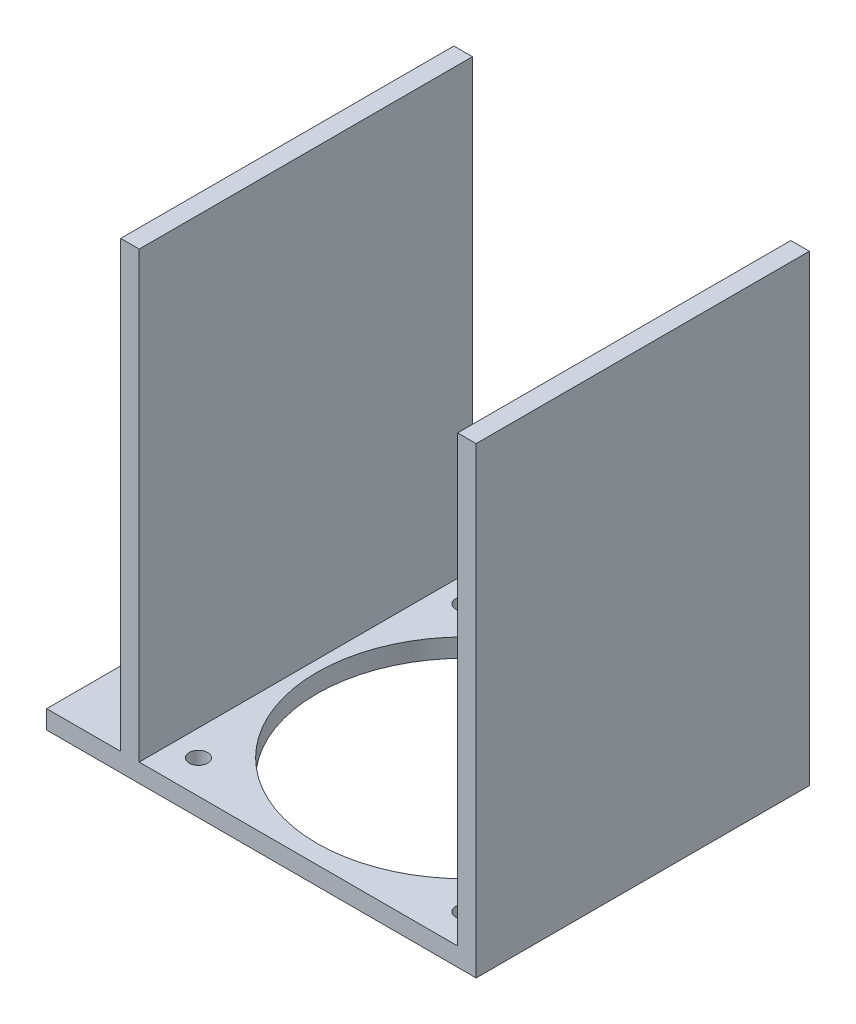
ISO-10303-21;
HEADER;
FILE_DESCRIPTION(('STEP AP214'),'2;1');
FILE_NAME('part.step','',(''),(''),'','','');
FILE_SCHEMA(('AUTOMOTIVE_DESIGN { 1 0 10303 214 1 1 1 1 }'));
ENDSEC;
DATA;
#1=APPLICATION_CONTEXT('core data for automotive mechanical design processes');
#2=APPLICATION_PROTOCOL_DEFINITION('international standard','automotive_design',2000,#1);
#3=PRODUCT_CONTEXT('',#1,'mechanical');
#4=PRODUCT('Part','Part','',(#3));
#5=PRODUCT_RELATED_PRODUCT_CATEGORY('part','',(#4));
#6=PRODUCT_DEFINITION_FORMATION('','',#4);
#7=PRODUCT_DEFINITION_CONTEXT('part definition',#1,'design');
#8=PRODUCT_DEFINITION('design','',#6,#7);
#9=PRODUCT_DEFINITION_SHAPE('','',#8);
#10=(LENGTH_UNIT() NAMED_UNIT(*) SI_UNIT(.MILLI.,.METRE.));
#11=(NAMED_UNIT(*) PLANE_ANGLE_UNIT() SI_UNIT($,.RADIAN.));
#12=(NAMED_UNIT(*) SI_UNIT($,.STERADIAN.) SOLID_ANGLE_UNIT());
#13=UNCERTAINTY_MEASURE_WITH_UNIT(LENGTH_MEASURE(1.E-05),#10,'distance_accuracy_value','');
#14=(GEOMETRIC_REPRESENTATION_CONTEXT(3) GLOBAL_UNCERTAINTY_ASSIGNED_CONTEXT((#13)) GLOBAL_UNIT_ASSIGNED_CONTEXT((#10,
#11,#12)) REPRESENTATION_CONTEXT('',''));
#15=CARTESIAN_POINT('',(0.,0.,0.));
#16=DIRECTION('',(0.,0.,1.));
#17=DIRECTION('',(1.,0.,0.));
#18=AXIS2_PLACEMENT_3D('',#15,#16,#17);
#19=CARTESIAN_POINT('',(0.,5.,0.));
#20=DIRECTION('',(0.,-1.,0.));
#21=DIRECTION('',(0.,0.,-1.));
#22=AXIS2_PLACEMENT_3D('',#19,#20,#21);
#23=PLANE('',#22);
#24=DIRECTION('',(0.,0.,1.));
#25=VECTOR('',#24,1.);
#26=CARTESIAN_POINT('',(20.,5.,-90.));
#27=LINE('',#26,#25);
#28=CARTESIAN_POINT('',(20.,5.,-90.));
#29=VERTEX_POINT('',#28);
#30=CARTESIAN_POINT('',(20.,5.,0.));
#31=VERTEX_POINT('',#30);
#32=EDGE_CURVE('E132',#29,#31,#27,.T.);
#33=ORIENTED_EDGE('',*,*,#32,.F.);
#34=DIRECTION('',(-1.,0.,0.));
#35=VECTOR('',#34,1.);
#36=CARTESIAN_POINT('',(0.,5.,-90.));
#37=LINE('',#36,#35);
#38=CARTESIAN_POINT('',(0.,5.,-90.));
#39=VERTEX_POINT('',#38);
#40=EDGE_CURVE('E193',#29,#39,#37,.T.);
#41=ORIENTED_EDGE('',*,*,#40,.T.);
#42=DIRECTION('',(0.,0.,1.));
#43=VECTOR('',#42,1.);
#44=CARTESIAN_POINT('',(0.,5.,0.));
#45=LINE('',#44,#43);
#46=CARTESIAN_POINT('',(0.,5.,0.));
#47=VERTEX_POINT('',#46);
#48=EDGE_CURVE('E188',#39,#47,#45,.T.);
#49=ORIENTED_EDGE('',*,*,#48,.T.);
#50=DIRECTION('',(1.,0.,0.));
#51=VECTOR('',#50,1.);
#52=CARTESIAN_POINT('',(0.,5.,0.));
#53=LINE('',#52,#51);
#54=EDGE_CURVE('E56',#47,#31,#53,.T.);
#55=ORIENTED_EDGE('',*,*,#54,.T.);
#56=EDGE_LOOP('',(#33,#41,#49,#55));
#57=FACE_BOUND('',#56,.T.);
#58=ADVANCED_FACE('F33',(#57),#23,.F.);
#59=CARTESIAN_POINT('',(68.,5.,-45.));
#60=DIRECTION('',(0.,-1.,0.));
#61=DIRECTION('',(0.,0.,-1.));
#62=AXIS2_PLACEMENT_3D('',#59,#60,#61);
#63=CIRCLE('',#62,40.);
#64=CARTESIAN_POINT('',(68.,5.,-85.));
#65=VERTEX_POINT('',#64);
#66=EDGE_CURVE('E165',#65,#65,#63,.T.);
#67=ORIENTED_EDGE('',*,*,#66,.T.);
#68=EDGE_LOOP('',(#67));
#69=FACE_BOUND('',#68,.T.);
#70=CARTESIAN_POINT('',(31.9999999999996,5.,-9.00000000000036));
#71=DIRECTION('',(0.,-1.,0.));
#72=DIRECTION('',(0.,0.,-1.));
#73=AXIS2_PLACEMENT_3D('',#70,#71,#72);
#74=CIRCLE('',#73,2.5);
#75=CARTESIAN_POINT('',(31.9999999999996,5.,-11.5000000000004));
#76=VERTEX_POINT('',#75);
#77=EDGE_CURVE('E150',#76,#76,#74,.T.);
#78=ORIENTED_EDGE('',*,*,#77,.T.);
#79=EDGE_LOOP('',(#78));
#80=FACE_BOUND('',#79,.T.);
#81=CARTESIAN_POINT('',(104.,5.,-8.99999999999999));
#82=DIRECTION('',(0.,-1.,0.));
#83=DIRECTION('',(0.,0.,-1.));
#84=AXIS2_PLACEMENT_3D('',#81,#82,#83);
#85=CIRCLE('',#84,2.5);
#86=CARTESIAN_POINT('',(104.,5.,-11.5));
#87=VERTEX_POINT('',#86);
#88=EDGE_CURVE('E153',#87,#87,#85,.T.);
#89=ORIENTED_EDGE('',*,*,#88,.T.);
#90=EDGE_LOOP('',(#89));
#91=FACE_BOUND('',#90,.T.);
#92=CARTESIAN_POINT('',(104.,5.,-80.9999999999998));
#93=DIRECTION('',(0.,-1.,0.));
#94=DIRECTION('',(0.,0.,-1.));
#95=AXIS2_PLACEMENT_3D('',#92,#93,#94);
#96=CIRCLE('',#95,2.5);
#97=CARTESIAN_POINT('',(104.,5.,-83.4999999999999));
#98=VERTEX_POINT('',#97);
#99=EDGE_CURVE('E156',#98,#98,#96,.T.);
#100=ORIENTED_EDGE('',*,*,#99,.T.);
#101=EDGE_LOOP('',(#100));
#102=FACE_BOUND('',#101,.T.);
#103=CARTESIAN_POINT('',(32.,5.,-81.));
#104=DIRECTION('',(0.,-1.,0.));
#105=DIRECTION('',(0.,0.,-1.));
#106=AXIS2_PLACEMENT_3D('',#103,#104,#105);
#107=CIRCLE('',#106,2.5);
#108=CARTESIAN_POINT('',(32.,5.,-83.5));
#109=VERTEX_POINT('',#108);
#110=EDGE_CURVE('E159',#109,#109,#107,.T.);
#111=ORIENTED_EDGE('',*,*,#110,.T.);
#112=EDGE_LOOP('',(#111));
#113=FACE_BOUND('',#112,.T.);
#114=DIRECTION('',(0.,0.,-1.));
#115=VECTOR('',#114,1.);
#116=CARTESIAN_POINT('',(25.,5.,-90.));
#117=LINE('',#116,#115);
#118=CARTESIAN_POINT('',(25.,5.,0.));
#119=VERTEX_POINT('',#118);
#120=CARTESIAN_POINT('',(25.,5.,-90.));
#121=VERTEX_POINT('',#120);
#122=EDGE_CURVE('E48',#119,#121,#117,.T.);
#123=ORIENTED_EDGE('',*,*,#122,.F.);
#124=CARTESIAN_POINT('',(111.,5.,0.));
#125=VERTEX_POINT('',#124);
#126=EDGE_CURVE('E190',#119,#125,#53,.T.);
#127=ORIENTED_EDGE('',*,*,#126,.T.);
#128=DIRECTION('',(0.,0.,1.));
#129=VECTOR('',#128,1.);
#130=CARTESIAN_POINT('',(111.,5.,-90.));
#131=LINE('',#130,#129);
#132=CARTESIAN_POINT('',(111.,5.,-90.));
#133=VERTEX_POINT('',#132);
#134=EDGE_CURVE('E168',#133,#125,#131,.T.);
#135=ORIENTED_EDGE('',*,*,#134,.F.);
#136=EDGE_CURVE('E194',#133,#121,#37,.T.);
#137=ORIENTED_EDGE('',*,*,#136,.T.);
#138=EDGE_LOOP('',(#123,#127,#135,#137));
#139=FACE_BOUND('',#138,.T.);
#140=ADVANCED_FACE('F243',(#69,#80,#91,#102,#113,#139),#23,.F.);
#141=CARTESIAN_POINT('',(0.,5.,0.));
#142=DIRECTION('',(1.,0.,0.));
#143=DIRECTION('',(0.,0.,-1.));
#144=AXIS2_PLACEMENT_3D('',#141,#142,#143);
#145=PLANE('',#144);
#146=DIRECTION('',(0.,0.,1.));
#147=VECTOR('',#146,1.);
#148=CARTESIAN_POINT('',(0.,0.,0.));
#149=LINE('',#148,#147);
#150=CARTESIAN_POINT('',(0.,0.,-90.));
#151=VERTEX_POINT('',#150);
#152=CARTESIAN_POINT('',(0.,0.,0.));
#153=VERTEX_POINT('',#152);
#154=EDGE_CURVE('E187',#151,#153,#149,.T.);
#155=ORIENTED_EDGE('',*,*,#154,.T.);
#156=DIRECTION('',(0.,-1.,0.));
#157=VECTOR('',#156,1.);
#158=CARTESIAN_POINT('',(0.,5.,0.));
#159=LINE('',#158,#157);
#160=EDGE_CURVE('E11',#47,#153,#159,.T.);
#161=ORIENTED_EDGE('',*,*,#160,.F.);
#162=ORIENTED_EDGE('',*,*,#48,.F.);
#163=DIRECTION('',(0.,-1.,0.));
#164=VECTOR('',#163,1.);
#165=CARTESIAN_POINT('',(0.,5.,-90.));
#166=LINE('',#165,#164);
#167=EDGE_CURVE('E196',#39,#151,#166,.T.);
#168=ORIENTED_EDGE('',*,*,#167,.T.);
#169=EDGE_LOOP('',(#155,#161,#162,#168));
#170=FACE_BOUND('',#169,.T.);
#171=ADVANCED_FACE('F35',(#170),#145,.F.);
#172=CARTESIAN_POINT('',(0.,5.,0.));
#173=DIRECTION('',(0.,0.,-1.));
#174=DIRECTION('',(-1.,0.,0.));
#175=AXIS2_PLACEMENT_3D('',#172,#173,#174);
#176=PLANE('',#175);
#177=DIRECTION('',(1.,0.,0.));
#178=VECTOR('',#177,1.);
#179=CARTESIAN_POINT('',(0.,0.,0.));
#180=LINE('',#179,#178);
#181=CARTESIAN_POINT('',(116.,0.,0.));
#182=VERTEX_POINT('',#181);
#183=EDGE_CURVE('E199',#153,#182,#180,.T.);
#184=ORIENTED_EDGE('',*,*,#183,.T.);
#185=DIRECTION('',(0.,-1.,0.));
#186=VECTOR('',#185,1.);
#187=CARTESIAN_POINT('',(116.,5.,0.));
#188=LINE('',#187,#186);
#189=CARTESIAN_POINT('',(116.,125.,0.));
#190=VERTEX_POINT('',#189);
#191=EDGE_CURVE('E41',#190,#182,#188,.T.);
#192=ORIENTED_EDGE('',*,*,#191,.F.);
#193=DIRECTION('',(1.,0.,0.));
#194=VECTOR('',#193,1.);
#195=CARTESIAN_POINT('',(116.,125.,0.));
#196=LINE('',#195,#194);
#197=CARTESIAN_POINT('',(111.,125.,0.));
#198=VERTEX_POINT('',#197);
#199=EDGE_CURVE('E176',#198,#190,#196,.T.);
#200=ORIENTED_EDGE('',*,*,#199,.F.);
#201=DIRECTION('',(0.,-1.,0.));
#202=VECTOR('',#201,1.);
#203=CARTESIAN_POINT('',(111.,125.,0.));
#204=LINE('',#203,#202);
#205=EDGE_CURVE('E179',#198,#125,#204,.T.);
#206=ORIENTED_EDGE('',*,*,#205,.T.);
#207=ORIENTED_EDGE('',*,*,#126,.F.);
#208=DIRECTION('',(0.,-1.,0.));
#209=VECTOR('',#208,1.);
#210=CARTESIAN_POINT('',(25.,125.,0.));
#211=LINE('',#210,#209);
#212=CARTESIAN_POINT('',(25.,125.,0.));
#213=VERTEX_POINT('',#212);
#214=EDGE_CURVE('E117',#213,#119,#211,.T.);
#215=ORIENTED_EDGE('',*,*,#214,.F.);
#216=DIRECTION('',(1.,0.,0.));
#217=VECTOR('',#216,1.);
#218=CARTESIAN_POINT('',(20.,125.,0.));
#219=LINE('',#218,#217);
#220=CARTESIAN_POINT('',(20.,125.,0.));
#221=VERTEX_POINT('',#220);
#222=EDGE_CURVE('E110',#221,#213,#219,.T.);
#223=ORIENTED_EDGE('',*,*,#222,.F.);
#224=DIRECTION('',(0.,-1.,0.));
#225=VECTOR('',#224,1.);
#226=CARTESIAN_POINT('',(20.,125.,0.));
#227=LINE('',#226,#225);
#228=EDGE_CURVE('E114',#221,#31,#227,.T.);
#229=ORIENTED_EDGE('',*,*,#228,.T.);
#230=ORIENTED_EDGE('',*,*,#54,.F.);
#231=ORIENTED_EDGE('',*,*,#160,.T.);
#232=EDGE_LOOP('',(#184,#192,#200,#206,#207,#215,#223,#229,#230,#231));
#233=FACE_BOUND('',#232,.T.);
#234=ADVANCED_FACE('F112',(#233),#176,.F.);
#235=CARTESIAN_POINT('',(116.,5.,0.));
#236=DIRECTION('',(-1.,0.,0.));
#237=DIRECTION('',(0.,0.,1.));
#238=AXIS2_PLACEMENT_3D('',#235,#236,#237);
#239=PLANE('',#238);
#240=DIRECTION('',(0.,0.,-1.));
#241=VECTOR('',#240,1.);
#242=CARTESIAN_POINT('',(116.,0.,0.));
#243=LINE('',#242,#241);
#244=CARTESIAN_POINT('',(116.,0.,-90.));
#245=VERTEX_POINT('',#244);
#246=EDGE_CURVE('E201',#182,#245,#243,.T.);
#247=ORIENTED_EDGE('',*,*,#246,.T.);
#248=DIRECTION('',(0.,-1.,0.));
#249=VECTOR('',#248,1.);
#250=CARTESIAN_POINT('',(116.,5.,-90.));
#251=LINE('',#250,#249);
#252=CARTESIAN_POINT('',(116.,125.,-90.));
#253=VERTEX_POINT('',#252);
#254=EDGE_CURVE('E206',#253,#245,#251,.T.);
#255=ORIENTED_EDGE('',*,*,#254,.F.);
#256=DIRECTION('',(0.,0.,-1.));
#257=VECTOR('',#256,1.);
#258=CARTESIAN_POINT('',(116.,125.,-90.));
#259=LINE('',#258,#257);
#260=EDGE_CURVE('E169',#190,#253,#259,.T.);
#261=ORIENTED_EDGE('',*,*,#260,.F.);
#262=ORIENTED_EDGE('',*,*,#191,.T.);
#263=EDGE_LOOP('',(#247,#255,#261,#262));
#264=FACE_BOUND('',#263,.T.);
#265=ADVANCED_FACE('F212',(#264),#239,.F.);
#266=CARTESIAN_POINT('',(0.,5.,-90.));
#267=DIRECTION('',(0.,0.,1.));
#268=DIRECTION('',(1.,0.,0.));
#269=AXIS2_PLACEMENT_3D('',#266,#267,#268);
#270=PLANE('',#269);
#271=DIRECTION('',(-1.,0.,0.));
#272=VECTOR('',#271,1.);
#273=CARTESIAN_POINT('',(0.,0.,-90.));
#274=LINE('',#273,#272);
#275=EDGE_CURVE('E191',#245,#151,#274,.T.);
#276=ORIENTED_EDGE('',*,*,#275,.T.);
#277=ORIENTED_EDGE('',*,*,#167,.F.);
#278=ORIENTED_EDGE('',*,*,#40,.F.);
#279=DIRECTION('',(0.,-1.,0.));
#280=VECTOR('',#279,1.);
#281=CARTESIAN_POINT('',(20.,125.,-90.));
#282=LINE('',#281,#280);
#283=CARTESIAN_POINT('',(20.,125.,-90.));
#284=VERTEX_POINT('',#283);
#285=EDGE_CURVE('E225',#284,#29,#282,.T.);
#286=ORIENTED_EDGE('',*,*,#285,.F.);
#287=DIRECTION('',(-1.,0.,0.));
#288=VECTOR('',#287,1.);
#289=CARTESIAN_POINT('',(20.,125.,-90.));
#290=LINE('',#289,#288);
#291=CARTESIAN_POINT('',(25.,125.,-90.));
#292=VERTEX_POINT('',#291);
#293=EDGE_CURVE('E126',#292,#284,#290,.T.);
#294=ORIENTED_EDGE('',*,*,#293,.F.);
#295=DIRECTION('',(0.,-1.,0.));
#296=VECTOR('',#295,1.);
#297=CARTESIAN_POINT('',(25.,125.,-90.));
#298=LINE('',#297,#296);
#299=EDGE_CURVE('E138',#292,#121,#298,.T.);
#300=ORIENTED_EDGE('',*,*,#299,.T.);
#301=ORIENTED_EDGE('',*,*,#136,.F.);
#302=DIRECTION('',(0.,-1.,0.));
#303=VECTOR('',#302,1.);
#304=CARTESIAN_POINT('',(111.,125.,-90.));
#305=LINE('',#304,#303);
#306=CARTESIAN_POINT('',(111.,125.,-90.));
#307=VERTEX_POINT('',#306);
#308=EDGE_CURVE('E184',#307,#133,#305,.T.);
#309=ORIENTED_EDGE('',*,*,#308,.F.);
#310=DIRECTION('',(-1.,0.,0.));
#311=VECTOR('',#310,1.);
#312=CARTESIAN_POINT('',(116.,125.,-90.));
#313=LINE('',#312,#311);
#314=EDGE_CURVE('E172',#253,#307,#313,.T.);
#315=ORIENTED_EDGE('',*,*,#314,.F.);
#316=ORIENTED_EDGE('',*,*,#254,.T.);
#317=EDGE_LOOP('',(#276,#277,#278,#286,#294,#300,#301,#309,#315,#316));
#318=FACE_BOUND('',#317,.T.);
#319=ADVANCED_FACE('F220',(#318),#270,.F.);
#320=CARTESIAN_POINT('',(0.,0.,0.));
#321=DIRECTION('',(0.,-1.,0.));
#322=DIRECTION('',(0.,0.,-1.));
#323=AXIS2_PLACEMENT_3D('',#320,#321,#322);
#324=PLANE('',#323);
#325=CARTESIAN_POINT('',(32.,0.,-81.));
#326=DIRECTION('',(0.,-1.,0.));
#327=DIRECTION('',(0.,0.,-1.));
#328=AXIS2_PLACEMENT_3D('',#325,#326,#327);
#329=CIRCLE('',#328,2.5);
#330=CARTESIAN_POINT('',(32.,0.,-83.5));
#331=VERTEX_POINT('',#330);
#332=EDGE_CURVE('E133',#331,#331,#329,.T.);
#333=ORIENTED_EDGE('',*,*,#332,.F.);
#334=EDGE_LOOP('',(#333));
#335=FACE_BOUND('',#334,.T.);
#336=CARTESIAN_POINT('',(104.,0.,-80.9999999999998));
#337=DIRECTION('',(0.,-1.,0.));
#338=DIRECTION('',(0.,0.,-1.));
#339=AXIS2_PLACEMENT_3D('',#336,#337,#338);
#340=CIRCLE('',#339,2.5);
#341=CARTESIAN_POINT('',(104.,0.,-83.4999999999999));
#342=VERTEX_POINT('',#341);
#343=EDGE_CURVE('E136',#342,#342,#340,.T.);
#344=ORIENTED_EDGE('',*,*,#343,.F.);
#345=EDGE_LOOP('',(#344));
#346=FACE_BOUND('',#345,.T.);
#347=CARTESIAN_POINT('',(104.,0.,-8.99999999999999));
#348=DIRECTION('',(0.,-1.,0.));
#349=DIRECTION('',(0.,0.,-1.));
#350=AXIS2_PLACEMENT_3D('',#347,#348,#349);
#351=CIRCLE('',#350,2.5);
#352=CARTESIAN_POINT('',(104.,0.,-11.5));
#353=VERTEX_POINT('',#352);
#354=EDGE_CURVE('E142',#353,#353,#351,.T.);
#355=ORIENTED_EDGE('',*,*,#354,.F.);
#356=EDGE_LOOP('',(#355));
#357=FACE_BOUND('',#356,.T.);
#358=CARTESIAN_POINT('',(31.9999999999996,0.,-9.00000000000036));
#359=DIRECTION('',(0.,-1.,0.));
#360=DIRECTION('',(0.,0.,-1.));
#361=AXIS2_PLACEMENT_3D('',#358,#359,#360);
#362=CIRCLE('',#361,2.5);
#363=CARTESIAN_POINT('',(31.9999999999996,0.,-11.5000000000004));
#364=VERTEX_POINT('',#363);
#365=EDGE_CURVE('E145',#364,#364,#362,.T.);
#366=ORIENTED_EDGE('',*,*,#365,.F.);
#367=EDGE_LOOP('',(#366));
#368=FACE_BOUND('',#367,.T.);
#369=CARTESIAN_POINT('',(68.,0.,-45.));
#370=DIRECTION('',(0.,-1.,0.));
#371=DIRECTION('',(0.,0.,-1.));
#372=AXIS2_PLACEMENT_3D('',#369,#370,#371);
#373=CIRCLE('',#372,40.);
#374=CARTESIAN_POINT('',(68.,0.,-85.));
#375=VERTEX_POINT('',#374);
#376=EDGE_CURVE('E162',#375,#375,#373,.T.);
#377=ORIENTED_EDGE('',*,*,#376,.F.);
#378=EDGE_LOOP('',(#377));
#379=FACE_BOUND('',#378,.T.);
#380=ORIENTED_EDGE('',*,*,#154,.F.);
#381=ORIENTED_EDGE('',*,*,#275,.F.);
#382=ORIENTED_EDGE('',*,*,#246,.F.);
#383=ORIENTED_EDGE('',*,*,#183,.F.);
#384=EDGE_LOOP('',(#380,#381,#382,#383));
#385=FACE_BOUND('',#384,.T.);
#386=ADVANCED_FACE('F217',(#335,#346,#357,#368,#379,#385),#324,.T.);
#387=CARTESIAN_POINT('',(111.,125.,-90.));
#388=DIRECTION('',(1.,0.,0.));
#389=DIRECTION('',(0.,0.,-1.));
#390=AXIS2_PLACEMENT_3D('',#387,#388,#389);
#391=PLANE('',#390);
#392=ORIENTED_EDGE('',*,*,#134,.T.);
#393=ORIENTED_EDGE('',*,*,#205,.F.);
#394=DIRECTION('',(0.,0.,1.));
#395=VECTOR('',#394,1.);
#396=CARTESIAN_POINT('',(111.,125.,-90.));
#397=LINE('',#396,#395);
#398=EDGE_CURVE('E174',#307,#198,#397,.T.);
#399=ORIENTED_EDGE('',*,*,#398,.F.);
#400=ORIENTED_EDGE('',*,*,#308,.T.);
#401=EDGE_LOOP('',(#392,#393,#399,#400));
#402=FACE_BOUND('',#401,.T.);
#403=ADVANCED_FACE('F239',(#402),#391,.F.);
#404=CARTESIAN_POINT('',(0.,125.,0.));
#405=DIRECTION('',(0.,-1.,0.));
#406=DIRECTION('',(0.,0.,-1.));
#407=AXIS2_PLACEMENT_3D('',#404,#405,#406);
#408=PLANE('',#407);
#409=ORIENTED_EDGE('',*,*,#260,.T.);
#410=ORIENTED_EDGE('',*,*,#314,.T.);
#411=ORIENTED_EDGE('',*,*,#398,.T.);
#412=ORIENTED_EDGE('',*,*,#199,.T.);
#413=EDGE_LOOP('',(#409,#410,#411,#412));
#414=FACE_BOUND('',#413,.T.);
#415=ADVANCED_FACE('F242',(#414),#408,.F.);
#416=CARTESIAN_POINT('',(68.,15.,-45.));
#417=DIRECTION('',(0.,-1.,0.));
#418=DIRECTION('',(0.,0.,-1.));
#419=AXIS2_PLACEMENT_3D('',#416,#417,#418);
#420=CYLINDRICAL_SURFACE('',#419,40.);
#421=ORIENTED_EDGE('',*,*,#376,.T.);
#422=EDGE_LOOP('',(#421));
#423=FACE_BOUND('',#422,.T.);
#424=ORIENTED_EDGE('',*,*,#66,.F.);
#425=EDGE_LOOP('',(#424));
#426=FACE_BOUND('',#425,.T.);
#427=ADVANCED_FACE('F292',(#423,#426),#420,.F.);
#428=CARTESIAN_POINT('',(31.9999999999996,15.,-9.00000000000036));
#429=DIRECTION('',(0.,-1.,0.));
#430=DIRECTION('',(0.,0.,-1.));
#431=AXIS2_PLACEMENT_3D('',#428,#429,#430);
#432=CYLINDRICAL_SURFACE('',#431,2.5);
#433=ORIENTED_EDGE('',*,*,#365,.T.);
#434=EDGE_LOOP('',(#433));
#435=FACE_BOUND('',#434,.T.);
#436=ORIENTED_EDGE('',*,*,#77,.F.);
#437=EDGE_LOOP('',(#436));
#438=FACE_BOUND('',#437,.T.);
#439=ADVANCED_FACE('F297',(#435,#438),#432,.F.);
#440=CARTESIAN_POINT('',(104.,15.,-8.99999999999999));
#441=DIRECTION('',(0.,-1.,0.));
#442=DIRECTION('',(0.,0.,-1.));
#443=AXIS2_PLACEMENT_3D('',#440,#441,#442);
#444=CYLINDRICAL_SURFACE('',#443,2.5);
#445=ORIENTED_EDGE('',*,*,#354,.T.);
#446=EDGE_LOOP('',(#445));
#447=FACE_BOUND('',#446,.T.);
#448=ORIENTED_EDGE('',*,*,#88,.F.);
#449=EDGE_LOOP('',(#448));
#450=FACE_BOUND('',#449,.T.);
#451=ADVANCED_FACE('F304',(#447,#450),#444,.F.);
#452=CARTESIAN_POINT('',(104.,15.,-80.9999999999998));
#453=DIRECTION('',(0.,-1.,0.));
#454=DIRECTION('',(0.,0.,-1.));
#455=AXIS2_PLACEMENT_3D('',#452,#453,#454);
#456=CYLINDRICAL_SURFACE('',#455,2.5);
#457=ORIENTED_EDGE('',*,*,#343,.T.);
#458=EDGE_LOOP('',(#457));
#459=FACE_BOUND('',#458,.T.);
#460=ORIENTED_EDGE('',*,*,#99,.F.);
#461=EDGE_LOOP('',(#460));
#462=FACE_BOUND('',#461,.T.);
#463=ADVANCED_FACE('F312',(#459,#462),#456,.F.);
#464=CARTESIAN_POINT('',(32.,15.,-81.));
#465=DIRECTION('',(0.,-1.,0.));
#466=DIRECTION('',(0.,0.,-1.));
#467=AXIS2_PLACEMENT_3D('',#464,#465,#466);
#468=CYLINDRICAL_SURFACE('',#467,2.5);
#469=ORIENTED_EDGE('',*,*,#332,.T.);
#470=EDGE_LOOP('',(#469));
#471=FACE_BOUND('',#470,.T.);
#472=ORIENTED_EDGE('',*,*,#110,.F.);
#473=EDGE_LOOP('',(#472));
#474=FACE_BOUND('',#473,.T.);
#475=ADVANCED_FACE('F320',(#471,#474),#468,.F.);
#476=CARTESIAN_POINT('',(20.,125.,-90.));
#477=DIRECTION('',(1.,0.,0.));
#478=DIRECTION('',(0.,0.,-1.));
#479=AXIS2_PLACEMENT_3D('',#476,#477,#478);
#480=PLANE('',#479);
#481=ORIENTED_EDGE('',*,*,#32,.T.);
#482=ORIENTED_EDGE('',*,*,#228,.F.);
#483=DIRECTION('',(0.,0.,1.));
#484=VECTOR('',#483,1.);
#485=CARTESIAN_POINT('',(20.,125.,-90.));
#486=LINE('',#485,#484);
#487=EDGE_CURVE('E121',#284,#221,#486,.T.);
#488=ORIENTED_EDGE('',*,*,#487,.F.);
#489=ORIENTED_EDGE('',*,*,#285,.T.);
#490=EDGE_LOOP('',(#481,#482,#488,#489));
#491=FACE_BOUND('',#490,.T.);
#492=ADVANCED_FACE('F131',(#491),#480,.F.);
#493=CARTESIAN_POINT('',(25.,125.,-90.));
#494=DIRECTION('',(-1.,0.,0.));
#495=DIRECTION('',(0.,0.,1.));
#496=AXIS2_PLACEMENT_3D('',#493,#494,#495);
#497=PLANE('',#496);
#498=ORIENTED_EDGE('',*,*,#122,.T.);
#499=ORIENTED_EDGE('',*,*,#299,.F.);
#500=DIRECTION('',(0.,0.,-1.));
#501=VECTOR('',#500,1.);
#502=CARTESIAN_POINT('',(25.,125.,-90.));
#503=LINE('',#502,#501);
#504=EDGE_CURVE('E120',#213,#292,#503,.T.);
#505=ORIENTED_EDGE('',*,*,#504,.F.);
#506=ORIENTED_EDGE('',*,*,#214,.T.);
#507=EDGE_LOOP('',(#498,#499,#505,#506));
#508=FACE_BOUND('',#507,.T.);
#509=ADVANCED_FACE('F234',(#508),#497,.F.);
#510=CARTESIAN_POINT('',(0.,125.,0.));
#511=DIRECTION('',(0.,1.,0.));
#512=DIRECTION('',(0.,0.,1.));
#513=AXIS2_PLACEMENT_3D('',#510,#511,#512);
#514=PLANE('',#513);
#515=ORIENTED_EDGE('',*,*,#487,.T.);
#516=ORIENTED_EDGE('',*,*,#222,.T.);
#517=ORIENTED_EDGE('',*,*,#504,.T.);
#518=ORIENTED_EDGE('',*,*,#293,.T.);
#519=EDGE_LOOP('',(#515,#516,#517,#518));
#520=FACE_BOUND('',#519,.T.);
#521=ADVANCED_FACE('F124',(#520),#514,.T.);
#522=CLOSED_SHELL('',(#58,#140,#171,#234,#265,#319,#386,#403,#415,#427,#439,#451,#463,#475,#492,
#509,#521));
#523=MANIFOLD_SOLID_BREP('B2',#522);
#524=ADVANCED_BREP_SHAPE_REPRESENTATION('',(#18,#523),#14);
#525=SHAPE_DEFINITION_REPRESENTATION(#9,#524);
ENDSEC;
END-ISO-10303-21;
